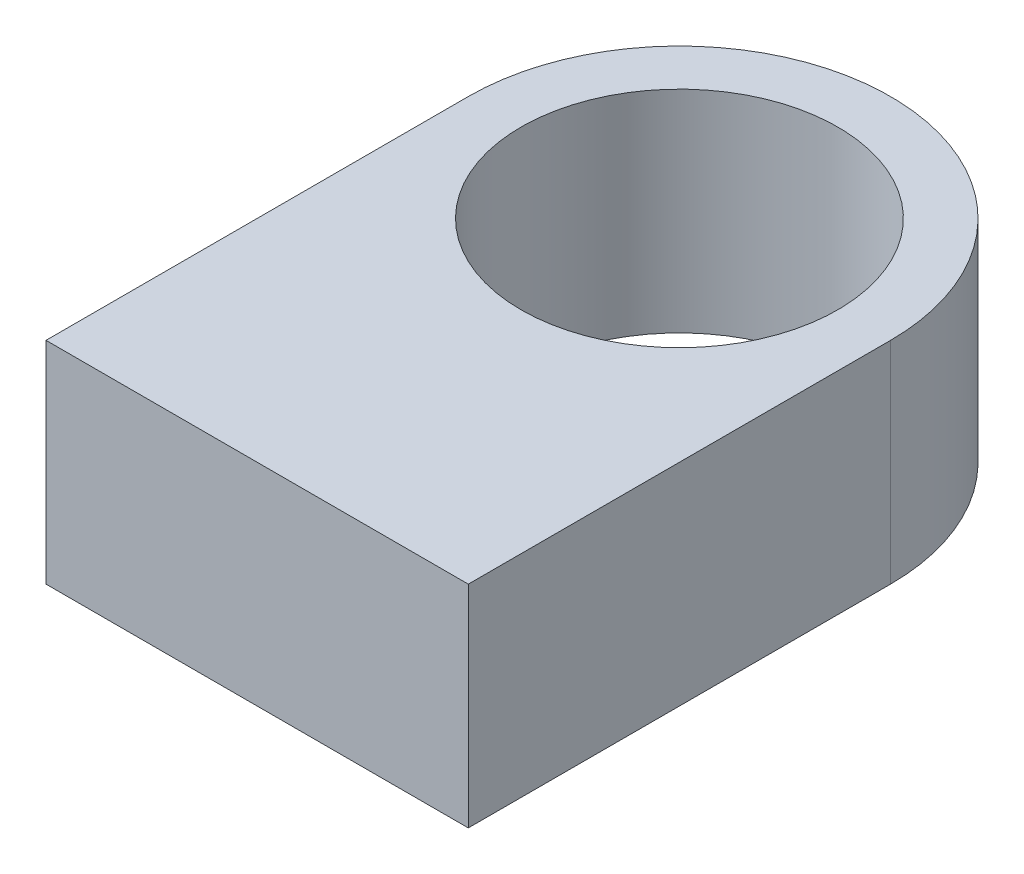
ISO-10303-21;
HEADER;
FILE_DESCRIPTION(('STEP AP214'),'2;1');
FILE_NAME('part.step','',(''),(''),'','','');
FILE_SCHEMA(('AUTOMOTIVE_DESIGN { 1 0 10303 214 1 1 1 1 }'));
ENDSEC;
DATA;
#1=APPLICATION_CONTEXT('core data for automotive mechanical design processes');
#2=APPLICATION_PROTOCOL_DEFINITION('international standard','automotive_design',2000,#1);
#3=PRODUCT_CONTEXT('',#1,'mechanical');
#4=PRODUCT('Part','Part','',(#3));
#5=PRODUCT_RELATED_PRODUCT_CATEGORY('part','',(#4));
#6=PRODUCT_DEFINITION_FORMATION('','',#4);
#7=PRODUCT_DEFINITION_CONTEXT('part definition',#1,'design');
#8=PRODUCT_DEFINITION('design','',#6,#7);
#9=PRODUCT_DEFINITION_SHAPE('','',#8);
#10=(LENGTH_UNIT() NAMED_UNIT(*) SI_UNIT(.MILLI.,.METRE.));
#11=(NAMED_UNIT(*) PLANE_ANGLE_UNIT() SI_UNIT($,.RADIAN.));
#12=(NAMED_UNIT(*) SI_UNIT($,.STERADIAN.) SOLID_ANGLE_UNIT());
#13=UNCERTAINTY_MEASURE_WITH_UNIT(LENGTH_MEASURE(1.E-05),#10,'distance_accuracy_value','');
#14=(GEOMETRIC_REPRESENTATION_CONTEXT(3) GLOBAL_UNCERTAINTY_ASSIGNED_CONTEXT((#13)) GLOBAL_UNIT_ASSIGNED_CONTEXT((#10,
#11,#12)) REPRESENTATION_CONTEXT('',''));
#15=CARTESIAN_POINT('',(0.,0.,0.));
#16=DIRECTION('',(0.,0.,1.));
#17=DIRECTION('',(1.,0.,0.));
#18=AXIS2_PLACEMENT_3D('',#15,#16,#17);
#19=CARTESIAN_POINT('',(0.,10.,-20.));
#20=DIRECTION('',(0.,-1.,0.));
#21=DIRECTION('',(0.,0.,-1.));
#22=AXIS2_PLACEMENT_3D('',#19,#20,#21);
#23=CYLINDRICAL_SURFACE('',#22,10.);
#24=CARTESIAN_POINT('',(0.,0.,-20.));
#25=DIRECTION('',(0.,1.,0.));
#26=DIRECTION('',(0.,0.,1.));
#27=AXIS2_PLACEMENT_3D('',#24,#25,#26);
#28=CIRCLE('',#27,10.);
#29=CARTESIAN_POINT('',(10.,0.,-20.));
#30=VERTEX_POINT('',#29);
#31=CARTESIAN_POINT('',(-10.,0.,-20.));
#32=VERTEX_POINT('',#31);
#33=EDGE_CURVE('E114',#30,#32,#28,.T.);
#34=ORIENTED_EDGE('',*,*,#33,.T.);
#35=DIRECTION('',(0.,-1.,0.));
#36=VECTOR('',#35,1.);
#37=CARTESIAN_POINT('',(-10.,10.,-20.));
#38=LINE('',#37,#36);
#39=CARTESIAN_POINT('',(-10.,10.,-20.));
#40=VERTEX_POINT('',#39);
#41=EDGE_CURVE('E11',#40,#32,#38,.T.);
#42=ORIENTED_EDGE('',*,*,#41,.F.);
#43=CARTESIAN_POINT('',(0.,10.,-20.));
#44=DIRECTION('',(0.,1.,0.));
#45=DIRECTION('',(0.,0.,1.));
#46=AXIS2_PLACEMENT_3D('',#43,#44,#45);
#47=CIRCLE('',#46,10.);
#48=CARTESIAN_POINT('',(10.,10.,-20.));
#49=VERTEX_POINT('',#48);
#50=EDGE_CURVE('E94',#49,#40,#47,.T.);
#51=ORIENTED_EDGE('',*,*,#50,.F.);
#52=DIRECTION('',(0.,-1.,0.));
#53=VECTOR('',#52,1.);
#54=CARTESIAN_POINT('',(10.,10.,-20.));
#55=LINE('',#54,#53);
#56=EDGE_CURVE('E106',#49,#30,#55,.T.);
#57=ORIENTED_EDGE('',*,*,#56,.T.);
#58=EDGE_LOOP('',(#34,#42,#51,#57));
#59=FACE_BOUND('',#58,.T.);
#60=ADVANCED_FACE('F41',(#59),#23,.T.);
#61=CARTESIAN_POINT('',(-9.99999999999999,10.,0.));
#62=DIRECTION('',(1.,0.,0.));
#63=DIRECTION('',(0.,0.,-1.));
#64=AXIS2_PLACEMENT_3D('',#61,#62,#63);
#65=PLANE('',#64);
#66=DIRECTION('',(0.,0.,1.));
#67=VECTOR('',#66,1.);
#68=CARTESIAN_POINT('',(-9.99999999999999,0.,0.));
#69=LINE('',#68,#67);
#70=CARTESIAN_POINT('',(-9.99999999999999,0.,0.));
#71=VERTEX_POINT('',#70);
#72=EDGE_CURVE('E99',#32,#71,#69,.T.);
#73=ORIENTED_EDGE('',*,*,#72,.T.);
#74=DIRECTION('',(0.,-1.,0.));
#75=VECTOR('',#74,1.);
#76=CARTESIAN_POINT('',(-9.99999999999999,10.,0.));
#77=LINE('',#76,#75);
#78=CARTESIAN_POINT('',(-9.99999999999999,10.,0.));
#79=VERTEX_POINT('',#78);
#80=EDGE_CURVE('E51',#79,#71,#77,.T.);
#81=ORIENTED_EDGE('',*,*,#80,.F.);
#82=DIRECTION('',(0.,0.,1.));
#83=VECTOR('',#82,1.);
#84=CARTESIAN_POINT('',(-9.99999999999999,10.,0.));
#85=LINE('',#84,#83);
#86=EDGE_CURVE('E89',#40,#79,#85,.T.);
#87=ORIENTED_EDGE('',*,*,#86,.F.);
#88=ORIENTED_EDGE('',*,*,#41,.T.);
#89=EDGE_LOOP('',(#73,#81,#87,#88));
#90=FACE_BOUND('',#89,.T.);
#91=ADVANCED_FACE('F98',(#90),#65,.F.);
#92=CARTESIAN_POINT('',(0.,10.,0.));
#93=DIRECTION('',(0.,0.,-1.));
#94=DIRECTION('',(-1.,0.,0.));
#95=AXIS2_PLACEMENT_3D('',#92,#93,#94);
#96=PLANE('',#95);
#97=DIRECTION('',(1.,0.,0.));
#98=VECTOR('',#97,1.);
#99=CARTESIAN_POINT('',(0.,0.,0.));
#100=LINE('',#99,#98);
#101=CARTESIAN_POINT('',(10.,0.,0.));
#102=VERTEX_POINT('',#101);
#103=EDGE_CURVE('E76',#71,#102,#100,.T.);
#104=ORIENTED_EDGE('',*,*,#103,.T.);
#105=DIRECTION('',(0.,-1.,0.));
#106=VECTOR('',#105,1.);
#107=CARTESIAN_POINT('',(10.,10.,0.));
#108=LINE('',#107,#106);
#109=CARTESIAN_POINT('',(10.,10.,0.));
#110=VERTEX_POINT('',#109);
#111=EDGE_CURVE('E101',#110,#102,#108,.T.);
#112=ORIENTED_EDGE('',*,*,#111,.F.);
#113=DIRECTION('',(1.,0.,0.));
#114=VECTOR('',#113,1.);
#115=CARTESIAN_POINT('',(0.,10.,0.));
#116=LINE('',#115,#114);
#117=EDGE_CURVE('E92',#79,#110,#116,.T.);
#118=ORIENTED_EDGE('',*,*,#117,.F.);
#119=ORIENTED_EDGE('',*,*,#80,.T.);
#120=EDGE_LOOP('',(#104,#112,#118,#119));
#121=FACE_BOUND('',#120,.T.);
#122=ADVANCED_FACE('F102',(#121),#96,.F.);
#123=CARTESIAN_POINT('',(0.,10.,-20.));
#124=DIRECTION('',(0.,-1.,0.));
#125=DIRECTION('',(0.,0.,-1.));
#126=AXIS2_PLACEMENT_3D('',#123,#124,#125);
#127=CYLINDRICAL_SURFACE('',#126,7.5);
#128=CARTESIAN_POINT('',(0.,10.,-20.));
#129=DIRECTION('',(0.,1.,0.));
#130=DIRECTION('',(0.,0.,1.));
#131=AXIS2_PLACEMENT_3D('',#128,#129,#130);
#132=CIRCLE('',#131,7.5);
#133=CARTESIAN_POINT('',(0.,10.,-12.5));
#134=VERTEX_POINT('',#133);
#135=EDGE_CURVE('E124',#134,#134,#132,.T.);
#136=ORIENTED_EDGE('',*,*,#135,.T.);
#137=EDGE_LOOP('',(#136));
#138=FACE_BOUND('',#137,.T.);
#139=CARTESIAN_POINT('',(0.,0.,-20.));
#140=DIRECTION('',(0.,1.,0.));
#141=DIRECTION('',(0.,0.,1.));
#142=AXIS2_PLACEMENT_3D('',#139,#140,#141);
#143=CIRCLE('',#142,7.5);
#144=CARTESIAN_POINT('',(0.,0.,-12.5));
#145=VERTEX_POINT('',#144);
#146=EDGE_CURVE('E110',#145,#145,#143,.T.);
#147=ORIENTED_EDGE('',*,*,#146,.F.);
#148=EDGE_LOOP('',(#147));
#149=FACE_BOUND('',#148,.T.);
#150=ADVANCED_FACE('F43',(#138,#149),#127,.F.);
#151=CARTESIAN_POINT('',(10.,10.,0.));
#152=DIRECTION('',(-1.,0.,0.));
#153=DIRECTION('',(0.,0.,1.));
#154=AXIS2_PLACEMENT_3D('',#151,#152,#153);
#155=PLANE('',#154);
#156=DIRECTION('',(0.,0.,-1.));
#157=VECTOR('',#156,1.);
#158=CARTESIAN_POINT('',(10.,0.,0.));
#159=LINE('',#158,#157);
#160=EDGE_CURVE('E82',#102,#30,#159,.T.);
#161=ORIENTED_EDGE('',*,*,#160,.T.);
#162=ORIENTED_EDGE('',*,*,#56,.F.);
#163=DIRECTION('',(0.,0.,-1.));
#164=VECTOR('',#163,1.);
#165=CARTESIAN_POINT('',(10.,10.,0.));
#166=LINE('',#165,#164);
#167=EDGE_CURVE('E59',#110,#49,#166,.T.);
#168=ORIENTED_EDGE('',*,*,#167,.F.);
#169=ORIENTED_EDGE('',*,*,#111,.T.);
#170=EDGE_LOOP('',(#161,#162,#168,#169));
#171=FACE_BOUND('',#170,.T.);
#172=ADVANCED_FACE('F128',(#171),#155,.F.);
#173=CARTESIAN_POINT('',(0.,10.,0.));
#174=DIRECTION('',(0.,1.,0.));
#175=DIRECTION('',(0.,0.,1.));
#176=AXIS2_PLACEMENT_3D('',#173,#174,#175);
#177=PLANE('',#176);
#178=ORIENTED_EDGE('',*,*,#135,.F.);
#179=EDGE_LOOP('',(#178));
#180=FACE_BOUND('',#179,.T.);
#181=ORIENTED_EDGE('',*,*,#50,.T.);
#182=ORIENTED_EDGE('',*,*,#86,.T.);
#183=ORIENTED_EDGE('',*,*,#117,.T.);
#184=ORIENTED_EDGE('',*,*,#167,.T.);
#185=EDGE_LOOP('',(#181,#182,#183,#184));
#186=FACE_BOUND('',#185,.T.);
#187=ADVANCED_FACE('F90',(#180,#186),#177,.T.);
#188=CARTESIAN_POINT('',(0.,0.,0.));
#189=DIRECTION('',(0.,1.,0.));
#190=DIRECTION('',(0.,0.,1.));
#191=AXIS2_PLACEMENT_3D('',#188,#189,#190);
#192=PLANE('',#191);
#193=ORIENTED_EDGE('',*,*,#146,.T.);
#194=EDGE_LOOP('',(#193));
#195=FACE_BOUND('',#194,.T.);
#196=ORIENTED_EDGE('',*,*,#33,.F.);
#197=ORIENTED_EDGE('',*,*,#160,.F.);
#198=ORIENTED_EDGE('',*,*,#103,.F.);
#199=ORIENTED_EDGE('',*,*,#72,.F.);
#200=EDGE_LOOP('',(#196,#197,#198,#199));
#201=FACE_BOUND('',#200,.T.);
#202=ADVANCED_FACE('F131',(#195,#201),#192,.F.);
#203=CLOSED_SHELL('',(#60,#91,#122,#150,#172,#187,#202));
#204=MANIFOLD_SOLID_BREP('B2',#203);
#205=ADVANCED_BREP_SHAPE_REPRESENTATION('',(#18,#204),#14);
#206=SHAPE_DEFINITION_REPRESENTATION(#9,#205);
ENDSEC;
END-ISO-10303-21;
